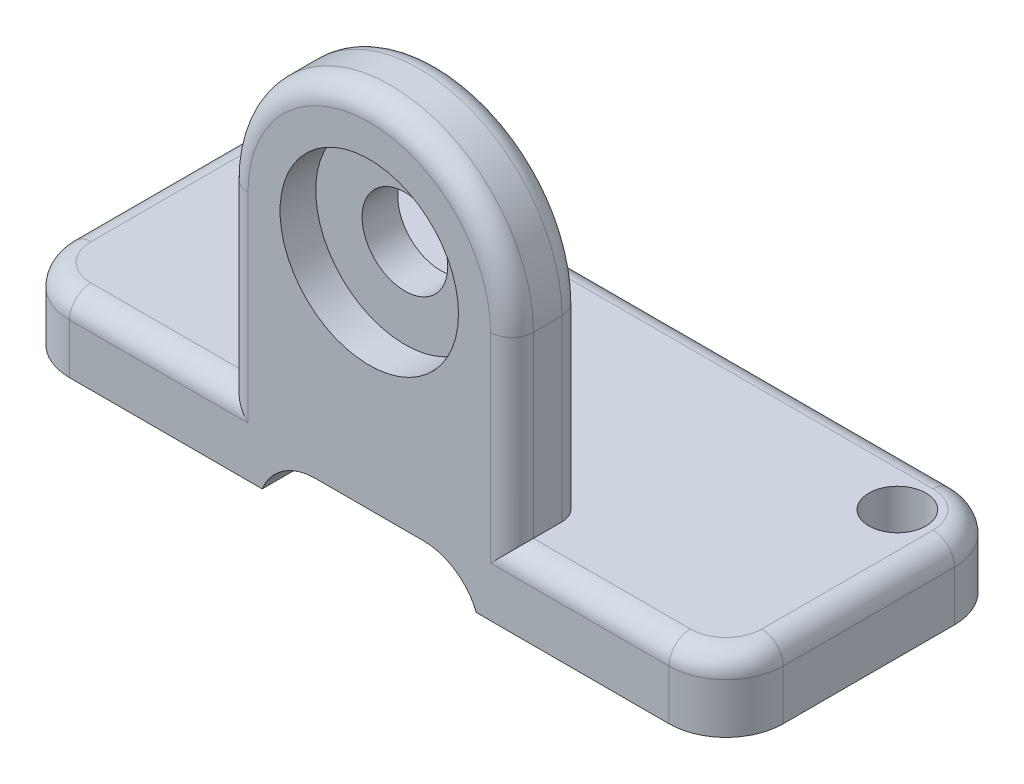
ISO-10303-21;
HEADER;
FILE_DESCRIPTION(('STEP AP214'),'2;1');
FILE_NAME('part.step','',(''),(''),'','','');
FILE_SCHEMA(('AUTOMOTIVE_DESIGN { 1 0 10303 214 1 1 1 1 }'));
ENDSEC;
DATA;
#1=APPLICATION_CONTEXT('core data for automotive mechanical design processes');
#2=APPLICATION_PROTOCOL_DEFINITION('international standard','automotive_design',2000,#1);
#3=PRODUCT_CONTEXT('',#1,'mechanical');
#4=PRODUCT('Part','Part','',(#3));
#5=PRODUCT_RELATED_PRODUCT_CATEGORY('part','',(#4));
#6=PRODUCT_DEFINITION_FORMATION('','',#4);
#7=PRODUCT_DEFINITION_CONTEXT('part definition',#1,'design');
#8=PRODUCT_DEFINITION('design','',#6,#7);
#9=PRODUCT_DEFINITION_SHAPE('','',#8);
#10=(LENGTH_UNIT() NAMED_UNIT(*) SI_UNIT(.MILLI.,.METRE.));
#11=(NAMED_UNIT(*) PLANE_ANGLE_UNIT() SI_UNIT($,.RADIAN.));
#12=(NAMED_UNIT(*) SI_UNIT($,.STERADIAN.) SOLID_ANGLE_UNIT());
#13=UNCERTAINTY_MEASURE_WITH_UNIT(LENGTH_MEASURE(1.E-05),#10,'distance_accuracy_value','');
#14=(GEOMETRIC_REPRESENTATION_CONTEXT(3) GLOBAL_UNCERTAINTY_ASSIGNED_CONTEXT((#13)) GLOBAL_UNIT_ASSIGNED_CONTEXT((#10,
#11,#12)) REPRESENTATION_CONTEXT('',''));
#15=CARTESIAN_POINT('',(0.,0.,0.));
#16=DIRECTION('',(0.,0.,1.));
#17=DIRECTION('',(1.,0.,0.));
#18=AXIS2_PLACEMENT_3D('',#15,#16,#17);
#19=CARTESIAN_POINT('',(-50.,10.,-20.));
#20=DIRECTION('',(0.,0.,1.));
#21=DIRECTION('',(1.,0.,0.));
#22=AXIS2_PLACEMENT_3D('',#19,#20,#21);
#23=PLANE('',#22);
#24=DIRECTION('',(0.,-1.,0.));
#25=VECTOR('',#24,1.);
#26=CARTESIAN_POINT('',(-42.,10.,-20.));
#27=LINE('',#26,#25);
#28=CARTESIAN_POINT('',(-42.,0.,-20.));
#29=VERTEX_POINT('',#28);
#30=CARTESIAN_POINT('',(-42.,7.,-20.));
#31=VERTEX_POINT('',#30);
#32=EDGE_CURVE('E299',#29,#31,#27,.F.);
#33=ORIENTED_EDGE('',*,*,#32,.T.);
#34=DIRECTION('',(-1.,0.,0.));
#35=VECTOR('',#34,1.);
#36=CARTESIAN_POINT('',(-50.,7.,-20.));
#37=LINE('',#36,#35);
#38=CARTESIAN_POINT('',(42.,7.,-20.));
#39=VERTEX_POINT('',#38);
#40=EDGE_CURVE('E360',#31,#39,#37,.F.);
#41=ORIENTED_EDGE('',*,*,#40,.T.);
#42=DIRECTION('',(0.,-1.,0.));
#43=VECTOR('',#42,1.);
#44=CARTESIAN_POINT('',(42.,10.,-20.));
#45=LINE('',#44,#43);
#46=CARTESIAN_POINT('',(42.,0.,-20.));
#47=VERTEX_POINT('',#46);
#48=EDGE_CURVE('E297',#39,#47,#45,.T.);
#49=ORIENTED_EDGE('',*,*,#48,.T.);
#50=DIRECTION('',(-1.,0.,0.));
#51=VECTOR('',#50,1.);
#52=CARTESIAN_POINT('',(-50.,0.,-20.));
#53=LINE('',#52,#51);
#54=CARTESIAN_POINT('',(15.,0.,-20.));
#55=VERTEX_POINT('',#54);
#56=EDGE_CURVE('E223',#47,#55,#53,.T.);
#57=ORIENTED_EDGE('',*,*,#56,.T.);
#58=CARTESIAN_POINT('',(7.58380151290434,-3.,-20.));
#59=DIRECTION('',(0.,0.,1.));
#60=DIRECTION('',(1.,0.,0.));
#61=AXIS2_PLACEMENT_3D('',#58,#59,#60);
#62=CIRCLE('',#61,8.);
#63=CARTESIAN_POINT('',(7.58380151290435,5.,-20.));
#64=VERTEX_POINT('',#63);
#65=EDGE_CURVE('E303',#55,#64,#62,.T.);
#66=ORIENTED_EDGE('',*,*,#65,.T.);
#67=DIRECTION('',(1.,0.,0.));
#68=VECTOR('',#67,1.);
#69=CARTESIAN_POINT('',(-15.,5.,-20.));
#70=LINE('',#69,#68);
#71=CARTESIAN_POINT('',(-7.58380151290433,5.,-20.));
#72=VERTEX_POINT('',#71);
#73=EDGE_CURVE('E208',#72,#64,#70,.T.);
#74=ORIENTED_EDGE('',*,*,#73,.F.);
#75=CARTESIAN_POINT('',(-7.58380151290433,-3.,-20.));
#76=DIRECTION('',(0.,0.,1.));
#77=DIRECTION('',(1.,0.,0.));
#78=AXIS2_PLACEMENT_3D('',#75,#76,#77);
#79=CIRCLE('',#78,8.);
#80=CARTESIAN_POINT('',(-15.,0.,-20.));
#81=VERTEX_POINT('',#80);
#82=EDGE_CURVE('E202',#72,#81,#79,.T.);
#83=ORIENTED_EDGE('',*,*,#82,.T.);
#84=EDGE_CURVE('E205',#81,#29,#53,.T.);
#85=ORIENTED_EDGE('',*,*,#84,.T.);
#86=EDGE_LOOP('',(#33,#41,#49,#57,#66,#74,#83,#85));
#87=FACE_BOUND('',#86,.T.);
#88=ADVANCED_FACE('F37',(#87),#23,.F.);
#89=CARTESIAN_POINT('',(-50.,10.,20.));
#90=DIRECTION('',(0.,0.,-1.));
#91=DIRECTION('',(-1.,0.,0.));
#92=AXIS2_PLACEMENT_3D('',#89,#90,#91);
#93=PLANE('',#92);
#94=CARTESIAN_POINT('',(0.,35.,20.));
#95=DIRECTION('',(0.,0.,1.));
#96=DIRECTION('',(1.,0.,0.));
#97=AXIS2_PLACEMENT_3D('',#94,#95,#96);
#98=CIRCLE('',#97,12.5);
#99=CARTESIAN_POINT('',(12.5,35.,20.));
#100=VERTEX_POINT('',#99);
#101=EDGE_CURVE('E240',#100,#100,#98,.T.);
#102=ORIENTED_EDGE('',*,*,#101,.F.);
#103=EDGE_LOOP('',(#102));
#104=FACE_BOUND('',#103,.T.);
#105=DIRECTION('',(0.,1.,0.));
#106=VECTOR('',#105,1.);
#107=CARTESIAN_POINT('',(-17.,10.,20.));
#108=LINE('',#107,#106);
#109=CARTESIAN_POINT('',(-17.,35.,20.));
#110=VERTEX_POINT('',#109);
#111=CARTESIAN_POINT('',(-17.,7.,20.));
#112=VERTEX_POINT('',#111);
#113=EDGE_CURVE('E348',#110,#112,#108,.F.);
#114=ORIENTED_EDGE('',*,*,#113,.T.);
#115=DIRECTION('',(1.,0.,0.));
#116=VECTOR('',#115,1.);
#117=CARTESIAN_POINT('',(-50.,7.,20.));
#118=LINE('',#117,#116);
#119=CARTESIAN_POINT('',(-42.,7.,20.));
#120=VERTEX_POINT('',#119);
#121=EDGE_CURVE('E350',#112,#120,#118,.F.);
#122=ORIENTED_EDGE('',*,*,#121,.T.);
#123=DIRECTION('',(0.,-1.,0.));
#124=VECTOR('',#123,1.);
#125=CARTESIAN_POINT('',(-42.,10.,20.));
#126=LINE('',#125,#124);
#127=CARTESIAN_POINT('',(-42.,0.,20.));
#128=VERTEX_POINT('',#127);
#129=EDGE_CURVE('E284',#120,#128,#126,.T.);
#130=ORIENTED_EDGE('',*,*,#129,.T.);
#131=DIRECTION('',(1.,0.,0.));
#132=VECTOR('',#131,1.);
#133=CARTESIAN_POINT('',(-50.,0.,20.));
#134=LINE('',#133,#132);
#135=CARTESIAN_POINT('',(-15.,0.,20.));
#136=VERTEX_POINT('',#135);
#137=EDGE_CURVE('E269',#128,#136,#134,.T.);
#138=ORIENTED_EDGE('',*,*,#137,.T.);
#139=CARTESIAN_POINT('',(-7.58380151290433,-3.,20.));
#140=DIRECTION('',(0.,0.,-1.));
#141=DIRECTION('',(-1.,0.,0.));
#142=AXIS2_PLACEMENT_3D('',#139,#140,#141);
#143=CIRCLE('',#142,8.);
#144=CARTESIAN_POINT('',(-7.58380151290433,5.,20.));
#145=VERTEX_POINT('',#144);
#146=EDGE_CURVE('E213',#136,#145,#143,.T.);
#147=ORIENTED_EDGE('',*,*,#146,.T.);
#148=DIRECTION('',(1.,0.,0.));
#149=VECTOR('',#148,1.);
#150=CARTESIAN_POINT('',(-15.,5.,20.));
#151=LINE('',#150,#149);
#152=CARTESIAN_POINT('',(7.58380151290435,5.,20.));
#153=VERTEX_POINT('',#152);
#154=EDGE_CURVE('E233',#145,#153,#151,.T.);
#155=ORIENTED_EDGE('',*,*,#154,.T.);
#156=CARTESIAN_POINT('',(7.58380151290434,-3.,20.));
#157=DIRECTION('',(0.,0.,-1.));
#158=DIRECTION('',(-1.,0.,0.));
#159=AXIS2_PLACEMENT_3D('',#156,#157,#158);
#160=CIRCLE('',#159,8.);
#161=CARTESIAN_POINT('',(15.,0.,20.));
#162=VERTEX_POINT('',#161);
#163=EDGE_CURVE('E212',#153,#162,#160,.T.);
#164=ORIENTED_EDGE('',*,*,#163,.T.);
#165=CARTESIAN_POINT('',(42.,0.,20.));
#166=VERTEX_POINT('',#165);
#167=EDGE_CURVE('E268',#162,#166,#134,.T.);
#168=ORIENTED_EDGE('',*,*,#167,.T.);
#169=DIRECTION('',(0.,-1.,0.));
#170=VECTOR('',#169,1.);
#171=CARTESIAN_POINT('',(42.,10.,20.));
#172=LINE('',#171,#170);
#173=CARTESIAN_POINT('',(42.,7.,20.));
#174=VERTEX_POINT('',#173);
#175=EDGE_CURVE('E286',#166,#174,#172,.F.);
#176=ORIENTED_EDGE('',*,*,#175,.T.);
#177=DIRECTION('',(1.,0.,0.));
#178=VECTOR('',#177,1.);
#179=CARTESIAN_POINT('',(-50.,7.,20.));
#180=LINE('',#179,#178);
#181=CARTESIAN_POINT('',(17.,7.,20.));
#182=VERTEX_POINT('',#181);
#183=EDGE_CURVE('E342',#174,#182,#180,.F.);
#184=ORIENTED_EDGE('',*,*,#183,.T.);
#185=DIRECTION('',(0.,1.,0.));
#186=VECTOR('',#185,1.);
#187=CARTESIAN_POINT('',(17.,35.,20.));
#188=LINE('',#187,#186);
#189=CARTESIAN_POINT('',(17.,35.,20.));
#190=VERTEX_POINT('',#189);
#191=EDGE_CURVE('E344',#182,#190,#188,.T.);
#192=ORIENTED_EDGE('',*,*,#191,.T.);
#193=CARTESIAN_POINT('',(0.,35.,20.));
#194=DIRECTION('',(0.,0.,-1.));
#195=DIRECTION('',(-1.,0.,0.));
#196=AXIS2_PLACEMENT_3D('',#193,#194,#195);
#197=CIRCLE('',#196,17.);
#198=EDGE_CURVE('E346',#190,#110,#197,.F.);
#199=ORIENTED_EDGE('',*,*,#198,.T.);
#200=EDGE_LOOP('',(#114,#122,#130,#138,#147,#155,#164,#168,#176,#184,#192,#199));
#201=FACE_BOUND('',#200,.T.);
#202=ADVANCED_FACE('F417',(#104,#201),#93,.F.);
#203=CARTESIAN_POINT('',(0.,0.,0.));
#204=DIRECTION('',(0.,-1.,0.));
#205=DIRECTION('',(0.,0.,-1.));
#206=AXIS2_PLACEMENT_3D('',#203,#204,#205);
#207=PLANE('',#206);
#208=CARTESIAN_POINT('',(-42.,0.,-12.));
#209=DIRECTION('',(0.,1.,0.));
#210=DIRECTION('',(0.,0.,1.));
#211=AXIS2_PLACEMENT_3D('',#208,#209,#210);
#212=CIRCLE('',#211,4.);
#213=CARTESIAN_POINT('',(-42.,0.,-8.));
#214=VERTEX_POINT('',#213);
#215=EDGE_CURVE('E855',#214,#214,#212,.T.);
#216=ORIENTED_EDGE('',*,*,#215,.T.);
#217=EDGE_LOOP('',(#216));
#218=FACE_BOUND('',#217,.T.);
#219=ORIENTED_EDGE('',*,*,#137,.F.);
#220=CARTESIAN_POINT('',(-42.,0.,12.));
#221=DIRECTION('',(0.,-1.,0.));
#222=DIRECTION('',(0.,0.,-1.));
#223=AXIS2_PLACEMENT_3D('',#220,#221,#222);
#224=CIRCLE('',#223,8.);
#225=CARTESIAN_POINT('',(-50.,0.,12.));
#226=VERTEX_POINT('',#225);
#227=EDGE_CURVE('E290',#128,#226,#224,.T.);
#228=ORIENTED_EDGE('',*,*,#227,.T.);
#229=DIRECTION('',(0.,0.,1.));
#230=VECTOR('',#229,1.);
#231=CARTESIAN_POINT('',(-50.,0.,20.));
#232=LINE('',#231,#230);
#233=CARTESIAN_POINT('',(-50.,0.,-12.));
#234=VERTEX_POINT('',#233);
#235=EDGE_CURVE('E265',#234,#226,#232,.T.);
#236=ORIENTED_EDGE('',*,*,#235,.F.);
#237=CARTESIAN_POINT('',(-42.,0.,-12.));
#238=DIRECTION('',(0.,-1.,0.));
#239=DIRECTION('',(0.,0.,-1.));
#240=AXIS2_PLACEMENT_3D('',#237,#238,#239);
#241=CIRCLE('',#240,8.);
#242=EDGE_CURVE('E222',#234,#29,#241,.T.);
#243=ORIENTED_EDGE('',*,*,#242,.T.);
#244=ORIENTED_EDGE('',*,*,#84,.F.);
#245=DIRECTION('',(0.,0.,1.));
#246=VECTOR('',#245,1.);
#247=CARTESIAN_POINT('',(-15.,0.,-20.));
#248=LINE('',#247,#246);
#249=EDGE_CURVE('E219',#81,#136,#248,.T.);
#250=ORIENTED_EDGE('',*,*,#249,.T.);
#251=EDGE_LOOP('',(#219,#228,#236,#243,#244,#250));
#252=FACE_BOUND('',#251,.T.);
#253=ADVANCED_FACE('F218',(#218,#252),#207,.T.);
#254=CARTESIAN_POINT('',(42.,0.,-12.));
#255=DIRECTION('',(0.,1.,0.));
#256=DIRECTION('',(0.,0.,1.));
#257=AXIS2_PLACEMENT_3D('',#254,#255,#256);
#258=CIRCLE('',#257,4.);
#259=CARTESIAN_POINT('',(42.,0.,-8.00000000000001));
#260=VERTEX_POINT('',#259);
#261=EDGE_CURVE('E827',#260,#260,#258,.T.);
#262=ORIENTED_EDGE('',*,*,#261,.T.);
#263=EDGE_LOOP('',(#262));
#264=FACE_BOUND('',#263,.T.);
#265=DIRECTION('',(0.,0.,-1.));
#266=VECTOR('',#265,1.);
#267=CARTESIAN_POINT('',(50.,0.,20.));
#268=LINE('',#267,#266);
#269=CARTESIAN_POINT('',(50.,0.,12.));
#270=VERTEX_POINT('',#269);
#271=CARTESIAN_POINT('',(50.,0.,-12.));
#272=VERTEX_POINT('',#271);
#273=EDGE_CURVE('E224',#270,#272,#268,.T.);
#274=ORIENTED_EDGE('',*,*,#273,.F.);
#275=CARTESIAN_POINT('',(42.,0.,12.));
#276=DIRECTION('',(0.,-1.,0.));
#277=DIRECTION('',(0.,0.,-1.));
#278=AXIS2_PLACEMENT_3D('',#275,#276,#277);
#279=CIRCLE('',#278,8.);
#280=EDGE_CURVE('E282',#270,#166,#279,.T.);
#281=ORIENTED_EDGE('',*,*,#280,.T.);
#282=ORIENTED_EDGE('',*,*,#167,.F.);
#283=DIRECTION('',(0.,0.,1.));
#284=VECTOR('',#283,1.);
#285=CARTESIAN_POINT('',(15.,0.,-20.));
#286=LINE('',#285,#284);
#287=EDGE_CURVE('E228',#55,#162,#286,.T.);
#288=ORIENTED_EDGE('',*,*,#287,.F.);
#289=ORIENTED_EDGE('',*,*,#56,.F.);
#290=CARTESIAN_POINT('',(42.,0.,-12.));
#291=DIRECTION('',(0.,-1.,0.));
#292=DIRECTION('',(0.,0.,-1.));
#293=AXIS2_PLACEMENT_3D('',#290,#291,#292);
#294=CIRCLE('',#293,8.);
#295=EDGE_CURVE('E280',#47,#272,#294,.T.);
#296=ORIENTED_EDGE('',*,*,#295,.T.);
#297=EDGE_LOOP('',(#274,#281,#282,#288,#289,#296));
#298=FACE_BOUND('',#297,.T.);
#299=ADVANCED_FACE('F687',(#264,#298),#207,.T.);
#300=CARTESIAN_POINT('',(0.,10.,0.));
#301=DIRECTION('',(0.,-1.,0.));
#302=DIRECTION('',(0.,0.,-1.));
#303=AXIS2_PLACEMENT_3D('',#300,#301,#302);
#304=PLANE('',#303);
#305=CARTESIAN_POINT('',(-42.,10.,-12.));
#306=DIRECTION('',(0.,1.,0.));
#307=DIRECTION('',(0.,0.,1.));
#308=AXIS2_PLACEMENT_3D('',#305,#306,#307);
#309=CIRCLE('',#308,4.);
#310=CARTESIAN_POINT('',(-42.,10.,-8.));
#311=VERTEX_POINT('',#310);
#312=EDGE_CURVE('E857',#311,#311,#309,.T.);
#313=ORIENTED_EDGE('',*,*,#312,.F.);
#314=EDGE_LOOP('',(#313));
#315=FACE_BOUND('',#314,.T.);
#316=CARTESIAN_POINT('',(42.,10.,-12.));
#317=DIRECTION('',(0.,1.,0.));
#318=DIRECTION('',(0.,0.,1.));
#319=AXIS2_PLACEMENT_3D('',#316,#317,#318);
#320=CIRCLE('',#319,4.);
#321=CARTESIAN_POINT('',(42.,10.,-8.00000000000001));
#322=VERTEX_POINT('',#321);
#323=EDGE_CURVE('E372',#322,#322,#320,.T.);
#324=ORIENTED_EDGE('',*,*,#323,.F.);
#325=EDGE_LOOP('',(#324));
#326=FACE_BOUND('',#325,.T.);
#327=CARTESIAN_POINT('',(-42.,10.,12.));
#328=DIRECTION('',(0.,-1.,0.));
#329=DIRECTION('',(0.,0.,-1.));
#330=AXIS2_PLACEMENT_3D('',#327,#328,#329);
#331=CIRCLE('',#330,5.);
#332=CARTESIAN_POINT('',(-47.,10.,12.));
#333=VERTEX_POINT('',#332);
#334=CARTESIAN_POINT('',(-42.,10.,17.));
#335=VERTEX_POINT('',#334);
#336=EDGE_CURVE('E335',#333,#335,#331,.F.);
#337=ORIENTED_EDGE('',*,*,#336,.T.);
#338=DIRECTION('',(1.,0.,0.));
#339=VECTOR('',#338,1.);
#340=CARTESIAN_POINT('',(0.,10.,17.));
#341=LINE('',#340,#339);
#342=CARTESIAN_POINT('',(-20.,10.,17.));
#343=VERTEX_POINT('',#342);
#344=EDGE_CURVE('E337',#335,#343,#341,.T.);
#345=ORIENTED_EDGE('',*,*,#344,.T.);
#346=DIRECTION('',(0.,0.,1.));
#347=VECTOR('',#346,1.);
#348=CARTESIAN_POINT('',(-20.,10.,0.));
#349=LINE('',#348,#347);
#350=CARTESIAN_POINT('',(-20.,10.,13.));
#351=VERTEX_POINT('',#350);
#352=EDGE_CURVE('E260',#351,#343,#349,.T.);
#353=ORIENTED_EDGE('',*,*,#352,.F.);
#354=CARTESIAN_POINT('',(-17.,10.,13.));
#355=DIRECTION('',(0.,-1.,0.));
#356=DIRECTION('',(0.,0.,-1.));
#357=AXIS2_PLACEMENT_3D('',#354,#355,#356);
#358=CIRCLE('',#357,3.);
#359=CARTESIAN_POINT('',(-17.,10.,10.));
#360=VERTEX_POINT('',#359);
#361=EDGE_CURVE('E11',#351,#360,#358,.T.);
#362=ORIENTED_EDGE('',*,*,#361,.T.);
#363=DIRECTION('',(1.,0.,0.));
#364=VECTOR('',#363,1.);
#365=CARTESIAN_POINT('',(0.,10.,10.));
#366=LINE('',#365,#364);
#367=CARTESIAN_POINT('',(17.,10.,10.));
#368=VERTEX_POINT('',#367);
#369=EDGE_CURVE('E254',#360,#368,#366,.T.);
#370=ORIENTED_EDGE('',*,*,#369,.T.);
#371=CARTESIAN_POINT('',(17.,10.,13.));
#372=DIRECTION('',(0.,-1.,0.));
#373=DIRECTION('',(0.,0.,-1.));
#374=AXIS2_PLACEMENT_3D('',#371,#372,#373);
#375=CIRCLE('',#374,3.);
#376=CARTESIAN_POINT('',(20.,10.,13.));
#377=VERTEX_POINT('',#376);
#378=EDGE_CURVE('E46',#368,#377,#375,.T.);
#379=ORIENTED_EDGE('',*,*,#378,.T.);
#380=DIRECTION('',(0.,0.,1.));
#381=VECTOR('',#380,1.);
#382=CARTESIAN_POINT('',(20.,10.,0.));
#383=LINE('',#382,#381);
#384=CARTESIAN_POINT('',(20.,10.,17.));
#385=VERTEX_POINT('',#384);
#386=EDGE_CURVE('E257',#377,#385,#383,.T.);
#387=ORIENTED_EDGE('',*,*,#386,.T.);
#388=DIRECTION('',(1.,0.,0.));
#389=VECTOR('',#388,1.);
#390=CARTESIAN_POINT('',(0.,10.,17.));
#391=LINE('',#390,#389);
#392=CARTESIAN_POINT('',(42.,10.,17.));
#393=VERTEX_POINT('',#392);
#394=EDGE_CURVE('E320',#385,#393,#391,.T.);
#395=ORIENTED_EDGE('',*,*,#394,.T.);
#396=CARTESIAN_POINT('',(42.,10.,12.));
#397=DIRECTION('',(0.,-1.,0.));
#398=DIRECTION('',(0.,0.,-1.));
#399=AXIS2_PLACEMENT_3D('',#396,#397,#398);
#400=CIRCLE('',#399,5.);
#401=CARTESIAN_POINT('',(47.,10.,12.));
#402=VERTEX_POINT('',#401);
#403=EDGE_CURVE('E322',#393,#402,#400,.F.);
#404=ORIENTED_EDGE('',*,*,#403,.T.);
#405=DIRECTION('',(0.,0.,-1.));
#406=VECTOR('',#405,1.);
#407=CARTESIAN_POINT('',(47.,10.,0.));
#408=LINE('',#407,#406);
#409=CARTESIAN_POINT('',(47.,10.,-12.));
#410=VERTEX_POINT('',#409);
#411=EDGE_CURVE('E324',#402,#410,#408,.T.);
#412=ORIENTED_EDGE('',*,*,#411,.T.);
#413=CARTESIAN_POINT('',(42.,10.,-12.));
#414=DIRECTION('',(0.,-1.,0.));
#415=DIRECTION('',(0.,0.,-1.));
#416=AXIS2_PLACEMENT_3D('',#413,#414,#415);
#417=CIRCLE('',#416,5.);
#418=CARTESIAN_POINT('',(42.,10.,-17.));
#419=VERTEX_POINT('',#418);
#420=EDGE_CURVE('E326',#410,#419,#417,.F.);
#421=ORIENTED_EDGE('',*,*,#420,.T.);
#422=DIRECTION('',(-1.,0.,0.));
#423=VECTOR('',#422,1.);
#424=CARTESIAN_POINT('',(0.,10.,-17.));
#425=LINE('',#424,#423);
#426=CARTESIAN_POINT('',(-42.,10.,-17.));
#427=VERTEX_POINT('',#426);
#428=EDGE_CURVE('E328',#419,#427,#425,.T.);
#429=ORIENTED_EDGE('',*,*,#428,.T.);
#430=CARTESIAN_POINT('',(-42.,10.,-12.));
#431=DIRECTION('',(0.,-1.,0.));
#432=DIRECTION('',(0.,0.,-1.));
#433=AXIS2_PLACEMENT_3D('',#430,#431,#432);
#434=CIRCLE('',#433,5.);
#435=CARTESIAN_POINT('',(-47.,10.,-12.));
#436=VERTEX_POINT('',#435);
#437=EDGE_CURVE('E330',#427,#436,#434,.F.);
#438=ORIENTED_EDGE('',*,*,#437,.T.);
#439=DIRECTION('',(0.,0.,1.));
#440=VECTOR('',#439,1.);
#441=CARTESIAN_POINT('',(-47.,10.,0.));
#442=LINE('',#441,#440);
#443=EDGE_CURVE('E333',#436,#333,#442,.T.);
#444=ORIENTED_EDGE('',*,*,#443,.T.);
#445=EDGE_LOOP('',(#337,#345,#353,#362,#370,#379,#387,#395,#404,#412,#421,#429,#438,#444));
#446=FACE_BOUND('',#445,.T.);
#447=ADVANCED_FACE('F437',(#315,#326,#446),#304,.F.);
#448=CARTESIAN_POINT('',(50.,10.,20.));
#449=DIRECTION('',(-1.,0.,0.));
#450=DIRECTION('',(0.,0.,1.));
#451=AXIS2_PLACEMENT_3D('',#448,#449,#450);
#452=PLANE('',#451);
#453=DIRECTION('',(0.,-1.,0.));
#454=VECTOR('',#453,1.);
#455=CARTESIAN_POINT('',(50.,10.,-12.));
#456=LINE('',#455,#454);
#457=CARTESIAN_POINT('',(50.,7.,-12.));
#458=VERTEX_POINT('',#457);
#459=EDGE_CURVE('E276',#272,#458,#456,.F.);
#460=ORIENTED_EDGE('',*,*,#459,.T.);
#461=DIRECTION('',(0.,0.,-1.));
#462=VECTOR('',#461,1.);
#463=CARTESIAN_POINT('',(50.,7.,20.));
#464=LINE('',#463,#462);
#465=CARTESIAN_POINT('',(50.,7.,12.));
#466=VERTEX_POINT('',#465);
#467=EDGE_CURVE('E54',#458,#466,#464,.F.);
#468=ORIENTED_EDGE('',*,*,#467,.T.);
#469=DIRECTION('',(0.,-1.,0.));
#470=VECTOR('',#469,1.);
#471=CARTESIAN_POINT('',(50.,10.,12.));
#472=LINE('',#471,#470);
#473=EDGE_CURVE('E278',#466,#270,#472,.T.);
#474=ORIENTED_EDGE('',*,*,#473,.T.);
#475=ORIENTED_EDGE('',*,*,#273,.T.);
#476=EDGE_LOOP('',(#460,#468,#474,#475));
#477=FACE_BOUND('',#476,.T.);
#478=ADVANCED_FACE('F490',(#477),#452,.F.);
#479=CARTESIAN_POINT('',(-50.,10.,20.));
#480=DIRECTION('',(1.,0.,0.));
#481=DIRECTION('',(0.,0.,-1.));
#482=AXIS2_PLACEMENT_3D('',#479,#480,#481);
#483=PLANE('',#482);
#484=DIRECTION('',(0.,-1.,0.));
#485=VECTOR('',#484,1.);
#486=CARTESIAN_POINT('',(-50.,10.,12.));
#487=LINE('',#486,#485);
#488=CARTESIAN_POINT('',(-50.,7.,12.));
#489=VERTEX_POINT('',#488);
#490=EDGE_CURVE('E294',#226,#489,#487,.F.);
#491=ORIENTED_EDGE('',*,*,#490,.T.);
#492=DIRECTION('',(0.,0.,1.));
#493=VECTOR('',#492,1.);
#494=CARTESIAN_POINT('',(-50.,7.,20.));
#495=LINE('',#494,#493);
#496=CARTESIAN_POINT('',(-50.,7.,-12.));
#497=VERTEX_POINT('',#496);
#498=EDGE_CURVE('E356',#489,#497,#495,.F.);
#499=ORIENTED_EDGE('',*,*,#498,.T.);
#500=DIRECTION('',(0.,-1.,0.));
#501=VECTOR('',#500,1.);
#502=CARTESIAN_POINT('',(-50.,10.,-12.));
#503=LINE('',#502,#501);
#504=EDGE_CURVE('E292',#497,#234,#503,.T.);
#505=ORIENTED_EDGE('',*,*,#504,.T.);
#506=ORIENTED_EDGE('',*,*,#235,.T.);
#507=EDGE_LOOP('',(#491,#499,#505,#506));
#508=FACE_BOUND('',#507,.T.);
#509=ADVANCED_FACE('F489',(#508),#483,.F.);
#510=CARTESIAN_POINT('',(-20.,0.,10.));
#511=DIRECTION('',(1.,0.,0.));
#512=DIRECTION('',(0.,0.,-1.));
#513=AXIS2_PLACEMENT_3D('',#510,#511,#512);
#514=PLANE('',#513);
#515=DIRECTION('',(0.,0.,1.));
#516=VECTOR('',#515,1.);
#517=CARTESIAN_POINT('',(-20.,35.,10.));
#518=LINE('',#517,#516);
#519=CARTESIAN_POINT('',(-20.,35.,13.));
#520=VERTEX_POINT('',#519);
#521=CARTESIAN_POINT('',(-20.,35.,17.));
#522=VERTEX_POINT('',#521);
#523=EDGE_CURVE('E251',#520,#522,#518,.T.);
#524=ORIENTED_EDGE('',*,*,#523,.F.);
#525=DIRECTION('',(0.,1.,0.));
#526=VECTOR('',#525,1.);
#527=CARTESIAN_POINT('',(-20.,10.,13.));
#528=LINE('',#527,#526);
#529=EDGE_CURVE('E318',#520,#351,#528,.F.);
#530=ORIENTED_EDGE('',*,*,#529,.T.);
#531=ORIENTED_EDGE('',*,*,#352,.T.);
#532=DIRECTION('',(0.,1.,0.));
#533=VECTOR('',#532,1.);
#534=CARTESIAN_POINT('',(-20.,0.,17.));
#535=LINE('',#534,#533);
#536=EDGE_CURVE('E316',#343,#522,#535,.T.);
#537=ORIENTED_EDGE('',*,*,#536,.T.);
#538=EDGE_LOOP('',(#524,#530,#531,#537));
#539=FACE_BOUND('',#538,.T.);
#540=ADVANCED_FACE('F459',(#539),#514,.F.);
#541=CARTESIAN_POINT('',(20.,0.,10.));
#542=DIRECTION('',(1.,0.,0.));
#543=DIRECTION('',(0.,1.,0.));
#544=AXIS2_PLACEMENT_3D('',#541,#542,#543);
#545=PLANE('',#544);
#546=ORIENTED_EDGE('',*,*,#386,.F.);
#547=DIRECTION('',(0.,1.,0.));
#548=VECTOR('',#547,1.);
#549=CARTESIAN_POINT('',(20.,0.,13.));
#550=LINE('',#549,#548);
#551=CARTESIAN_POINT('',(20.,35.,13.));
#552=VERTEX_POINT('',#551);
#553=EDGE_CURVE('E307',#377,#552,#550,.T.);
#554=ORIENTED_EDGE('',*,*,#553,.T.);
#555=DIRECTION('',(0.,0.,1.));
#556=VECTOR('',#555,1.);
#557=CARTESIAN_POINT('',(20.,35.,10.));
#558=LINE('',#557,#556);
#559=CARTESIAN_POINT('',(20.,35.,17.));
#560=VERTEX_POINT('',#559);
#561=EDGE_CURVE('E246',#552,#560,#558,.T.);
#562=ORIENTED_EDGE('',*,*,#561,.T.);
#563=DIRECTION('',(0.,1.,0.));
#564=VECTOR('',#563,1.);
#565=CARTESIAN_POINT('',(20.,10.,17.));
#566=LINE('',#565,#564);
#567=EDGE_CURVE('E305',#560,#385,#566,.F.);
#568=ORIENTED_EDGE('',*,*,#567,.T.);
#569=EDGE_LOOP('',(#546,#554,#562,#568));
#570=FACE_BOUND('',#569,.T.);
#571=ADVANCED_FACE('F443',(#570),#545,.T.);
#572=CARTESIAN_POINT('',(0.,35.,10.));
#573=DIRECTION('',(0.,0.,-1.));
#574=DIRECTION('',(-1.,0.,0.));
#575=AXIS2_PLACEMENT_3D('',#572,#573,#574);
#576=PLANE('',#575);
#577=CARTESIAN_POINT('',(0.,35.,10.));
#578=DIRECTION('',(0.,0.,1.));
#579=DIRECTION('',(1.,0.,0.));
#580=AXIS2_PLACEMENT_3D('',#577,#578,#579);
#581=CIRCLE('',#580,6.);
#582=CARTESIAN_POINT('',(6.,35.,10.));
#583=VERTEX_POINT('',#582);
#584=EDGE_CURVE('E237',#583,#583,#581,.T.);
#585=ORIENTED_EDGE('',*,*,#584,.T.);
#586=EDGE_LOOP('',(#585));
#587=FACE_BOUND('',#586,.T.);
#588=CARTESIAN_POINT('',(0.,35.,10.));
#589=DIRECTION('',(0.,0.,-1.));
#590=DIRECTION('',(-1.,0.,0.));
#591=AXIS2_PLACEMENT_3D('',#588,#589,#590);
#592=CIRCLE('',#591,17.);
#593=CARTESIAN_POINT('',(-17.,35.,10.));
#594=VERTEX_POINT('',#593);
#595=CARTESIAN_POINT('',(17.,35.,10.));
#596=VERTEX_POINT('',#595);
#597=EDGE_CURVE('E310',#594,#596,#592,.T.);
#598=ORIENTED_EDGE('',*,*,#597,.T.);
#599=DIRECTION('',(0.,1.,0.));
#600=VECTOR('',#599,1.);
#601=CARTESIAN_POINT('',(17.,35.,10.));
#602=LINE('',#601,#600);
#603=EDGE_CURVE('E314',#596,#368,#602,.F.);
#604=ORIENTED_EDGE('',*,*,#603,.T.);
#605=ORIENTED_EDGE('',*,*,#369,.F.);
#606=DIRECTION('',(0.,1.,0.));
#607=VECTOR('',#606,1.);
#608=CARTESIAN_POINT('',(-17.,35.,10.));
#609=LINE('',#608,#607);
#610=EDGE_CURVE('E312',#360,#594,#609,.T.);
#611=ORIENTED_EDGE('',*,*,#610,.T.);
#612=EDGE_LOOP('',(#598,#604,#605,#611));
#613=FACE_BOUND('',#612,.T.);
#614=ADVANCED_FACE('F468',(#587,#613),#576,.T.);
#615=CARTESIAN_POINT('',(0.,35.,10.));
#616=DIRECTION('',(0.,0.,1.));
#617=DIRECTION('',(1.,0.,0.));
#618=AXIS2_PLACEMENT_3D('',#615,#616,#617);
#619=CYLINDRICAL_SURFACE('',#618,20.);
#620=ORIENTED_EDGE('',*,*,#561,.F.);
#621=CARTESIAN_POINT('',(0.,35.,13.));
#622=DIRECTION('',(0.,0.,-1.));
#623=DIRECTION('',(-1.,0.,0.));
#624=AXIS2_PLACEMENT_3D('',#621,#622,#623);
#625=CIRCLE('',#624,20.);
#626=EDGE_CURVE('E354',#552,#520,#625,.F.);
#627=ORIENTED_EDGE('',*,*,#626,.T.);
#628=ORIENTED_EDGE('',*,*,#523,.T.);
#629=CARTESIAN_POINT('',(0.,35.,17.));
#630=DIRECTION('',(0.,0.,-1.));
#631=DIRECTION('',(-1.,0.,0.));
#632=AXIS2_PLACEMENT_3D('',#629,#630,#631);
#633=CIRCLE('',#632,20.);
#634=EDGE_CURVE('E352',#522,#560,#633,.T.);
#635=ORIENTED_EDGE('',*,*,#634,.T.);
#636=EDGE_LOOP('',(#620,#627,#628,#635));
#637=FACE_BOUND('',#636,.T.);
#638=ADVANCED_FACE('F456',(#637),#619,.T.);
#639=CARTESIAN_POINT('',(0.,35.,15.));
#640=DIRECTION('',(0.,0.,1.));
#641=DIRECTION('',(1.,0.,0.));
#642=AXIS2_PLACEMENT_3D('',#639,#640,#641);
#643=CYLINDRICAL_SURFACE('',#642,12.5);
#644=CARTESIAN_POINT('',(0.,35.,15.));
#645=DIRECTION('',(0.,0.,1.));
#646=DIRECTION('',(1.,0.,0.));
#647=AXIS2_PLACEMENT_3D('',#644,#645,#646);
#648=CIRCLE('',#647,12.5);
#649=CARTESIAN_POINT('',(12.5,35.,15.));
#650=VERTEX_POINT('',#649);
#651=EDGE_CURVE('E243',#650,#650,#648,.T.);
#652=ORIENTED_EDGE('',*,*,#651,.F.);
#653=EDGE_LOOP('',(#652));
#654=FACE_BOUND('',#653,.T.);
#655=ORIENTED_EDGE('',*,*,#101,.T.);
#656=EDGE_LOOP('',(#655));
#657=FACE_BOUND('',#656,.T.);
#658=ADVANCED_FACE('F476',(#654,#657),#643,.F.);
#659=CARTESIAN_POINT('',(0.,35.,15.));
#660=DIRECTION('',(0.,0.,1.));
#661=DIRECTION('',(1.,0.,0.));
#662=AXIS2_PLACEMENT_3D('',#659,#660,#661);
#663=PLANE('',#662);
#664=CARTESIAN_POINT('',(0.,35.,15.));
#665=DIRECTION('',(0.,0.,1.));
#666=DIRECTION('',(1.,0.,0.));
#667=AXIS2_PLACEMENT_3D('',#664,#665,#666);
#668=CIRCLE('',#667,6.);
#669=CARTESIAN_POINT('',(6.,35.,15.));
#670=VERTEX_POINT('',#669);
#671=EDGE_CURVE('E231',#670,#670,#668,.T.);
#672=ORIENTED_EDGE('',*,*,#671,.F.);
#673=EDGE_LOOP('',(#672));
#674=FACE_BOUND('',#673,.T.);
#675=ORIENTED_EDGE('',*,*,#651,.T.);
#676=EDGE_LOOP('',(#675));
#677=FACE_BOUND('',#676,.T.);
#678=ADVANCED_FACE('F628',(#674,#677),#663,.T.);
#679=CARTESIAN_POINT('',(0.,35.,10.));
#680=DIRECTION('',(0.,0.,1.));
#681=DIRECTION('',(1.,0.,0.));
#682=AXIS2_PLACEMENT_3D('',#679,#680,#681);
#683=CYLINDRICAL_SURFACE('',#682,6.);
#684=ORIENTED_EDGE('',*,*,#584,.F.);
#685=EDGE_LOOP('',(#684));
#686=FACE_BOUND('',#685,.T.);
#687=ORIENTED_EDGE('',*,*,#671,.T.);
#688=EDGE_LOOP('',(#687));
#689=FACE_BOUND('',#688,.T.);
#690=ADVANCED_FACE('F620',(#686,#689),#683,.F.);
#691=CARTESIAN_POINT('',(-15.,5.,-20.));
#692=DIRECTION('',(0.,-1.,0.));
#693=DIRECTION('',(0.,0.,-1.));
#694=AXIS2_PLACEMENT_3D('',#691,#692,#693);
#695=PLANE('',#694);
#696=ORIENTED_EDGE('',*,*,#154,.F.);
#697=DIRECTION('',(0.,0.,1.));
#698=VECTOR('',#697,1.);
#699=CARTESIAN_POINT('',(-7.58380151290433,5.,-20.));
#700=LINE('',#699,#698);
#701=EDGE_CURVE('E274',#145,#72,#700,.F.);
#702=ORIENTED_EDGE('',*,*,#701,.T.);
#703=ORIENTED_EDGE('',*,*,#73,.T.);
#704=DIRECTION('',(0.,0.,-1.));
#705=VECTOR('',#704,1.);
#706=CARTESIAN_POINT('',(7.58380151290434,5.,20.));
#707=LINE('',#706,#705);
#708=EDGE_CURVE('E271',#64,#153,#707,.F.);
#709=ORIENTED_EDGE('',*,*,#708,.T.);
#710=EDGE_LOOP('',(#696,#702,#703,#709));
#711=FACE_BOUND('',#710,.T.);
#712=ADVANCED_FACE('F612',(#711),#695,.T.);
#713=CARTESIAN_POINT('',(42.,0.,-12.));
#714=DIRECTION('',(0.,1.,0.));
#715=DIRECTION('',(0.,0.,1.));
#716=AXIS2_PLACEMENT_3D('',#713,#714,#715);
#717=CYLINDRICAL_SURFACE('',#716,4.);
#718=ORIENTED_EDGE('',*,*,#261,.F.);
#719=EDGE_LOOP('',(#718));
#720=FACE_BOUND('',#719,.T.);
#721=ORIENTED_EDGE('',*,*,#323,.T.);
#722=EDGE_LOOP('',(#721));
#723=FACE_BOUND('',#722,.T.);
#724=ADVANCED_FACE('F603',(#720,#723),#717,.F.);
#725=CARTESIAN_POINT('',(-42.,0.,-12.));
#726=DIRECTION('',(0.,1.,0.));
#727=DIRECTION('',(0.,0.,1.));
#728=AXIS2_PLACEMENT_3D('',#725,#726,#727);
#729=CYLINDRICAL_SURFACE('',#728,4.);
#730=ORIENTED_EDGE('',*,*,#215,.F.);
#731=EDGE_LOOP('',(#730));
#732=FACE_BOUND('',#731,.T.);
#733=ORIENTED_EDGE('',*,*,#312,.T.);
#734=EDGE_LOOP('',(#733));
#735=FACE_BOUND('',#734,.T.);
#736=ADVANCED_FACE('F496',(#732,#735),#729,.F.);
#737=CARTESIAN_POINT('',(-7.58380151290433,-3.,-20.));
#738=DIRECTION('',(0.,0.,-1.));
#739=DIRECTION('',(-1.,0.,0.));
#740=AXIS2_PLACEMENT_3D('',#737,#738,#739);
#741=CYLINDRICAL_SURFACE('',#740,8.);
#742=ORIENTED_EDGE('',*,*,#82,.F.);
#743=ORIENTED_EDGE('',*,*,#701,.F.);
#744=ORIENTED_EDGE('',*,*,#146,.F.);
#745=ORIENTED_EDGE('',*,*,#249,.F.);
#746=EDGE_LOOP('',(#742,#743,#744,#745));
#747=FACE_BOUND('',#746,.T.);
#748=ADVANCED_FACE('F226',(#747),#741,.F.);
#749=CARTESIAN_POINT('',(7.58380151290434,-3.,-20.));
#750=DIRECTION('',(0.,0.,1.));
#751=DIRECTION('',(1.,0.,0.));
#752=AXIS2_PLACEMENT_3D('',#749,#750,#751);
#753=CYLINDRICAL_SURFACE('',#752,8.);
#754=ORIENTED_EDGE('',*,*,#65,.F.);
#755=ORIENTED_EDGE('',*,*,#287,.T.);
#756=ORIENTED_EDGE('',*,*,#163,.F.);
#757=ORIENTED_EDGE('',*,*,#708,.F.);
#758=EDGE_LOOP('',(#754,#755,#756,#757));
#759=FACE_BOUND('',#758,.T.);
#760=ADVANCED_FACE('F495',(#759),#753,.F.);
#761=CARTESIAN_POINT('',(42.,10.,12.));
#762=DIRECTION('',(0.,-1.,0.));
#763=DIRECTION('',(0.,0.,-1.));
#764=AXIS2_PLACEMENT_3D('',#761,#762,#763);
#765=CYLINDRICAL_SURFACE('',#764,8.);
#766=ORIENTED_EDGE('',*,*,#473,.F.);
#767=CARTESIAN_POINT('',(42.,7.,12.));
#768=DIRECTION('',(0.,-1.,0.));
#769=DIRECTION('',(0.,0.,-1.));
#770=AXIS2_PLACEMENT_3D('',#767,#768,#769);
#771=CIRCLE('',#770,8.);
#772=EDGE_CURVE('E364',#466,#174,#771,.T.);
#773=ORIENTED_EDGE('',*,*,#772,.T.);
#774=ORIENTED_EDGE('',*,*,#175,.F.);
#775=ORIENTED_EDGE('',*,*,#280,.F.);
#776=EDGE_LOOP('',(#766,#773,#774,#775));
#777=FACE_BOUND('',#776,.T.);
#778=ADVANCED_FACE('F424',(#777),#765,.T.);
#779=CARTESIAN_POINT('',(-42.,10.,12.));
#780=DIRECTION('',(0.,-1.,0.));
#781=DIRECTION('',(0.,0.,-1.));
#782=AXIS2_PLACEMENT_3D('',#779,#780,#781);
#783=CYLINDRICAL_SURFACE('',#782,8.);
#784=ORIENTED_EDGE('',*,*,#129,.F.);
#785=CARTESIAN_POINT('',(-42.,7.,12.));
#786=DIRECTION('',(0.,-1.,0.));
#787=DIRECTION('',(0.,0.,-1.));
#788=AXIS2_PLACEMENT_3D('',#785,#786,#787);
#789=CIRCLE('',#788,8.);
#790=EDGE_CURVE('E358',#120,#489,#789,.T.);
#791=ORIENTED_EDGE('',*,*,#790,.T.);
#792=ORIENTED_EDGE('',*,*,#490,.F.);
#793=ORIENTED_EDGE('',*,*,#227,.F.);
#794=EDGE_LOOP('',(#784,#791,#792,#793));
#795=FACE_BOUND('',#794,.T.);
#796=ADVANCED_FACE('F502',(#795),#783,.T.);
#797=CARTESIAN_POINT('',(-42.,10.,-12.));
#798=DIRECTION('',(0.,-1.,0.));
#799=DIRECTION('',(0.,0.,-1.));
#800=AXIS2_PLACEMENT_3D('',#797,#798,#799);
#801=CYLINDRICAL_SURFACE('',#800,8.);
#802=ORIENTED_EDGE('',*,*,#504,.F.);
#803=CARTESIAN_POINT('',(-42.,7.,-12.));
#804=DIRECTION('',(0.,-1.,0.));
#805=DIRECTION('',(0.,0.,-1.));
#806=AXIS2_PLACEMENT_3D('',#803,#804,#805);
#807=CIRCLE('',#806,8.);
#808=EDGE_CURVE('E339',#497,#31,#807,.T.);
#809=ORIENTED_EDGE('',*,*,#808,.T.);
#810=ORIENTED_EDGE('',*,*,#32,.F.);
#811=ORIENTED_EDGE('',*,*,#242,.F.);
#812=EDGE_LOOP('',(#802,#809,#810,#811));
#813=FACE_BOUND('',#812,.T.);
#814=ADVANCED_FACE('F505',(#813),#801,.T.);
#815=CARTESIAN_POINT('',(42.,10.,-12.));
#816=DIRECTION('',(0.,-1.,0.));
#817=DIRECTION('',(0.,0.,-1.));
#818=AXIS2_PLACEMENT_3D('',#815,#816,#817);
#819=CYLINDRICAL_SURFACE('',#818,8.);
#820=ORIENTED_EDGE('',*,*,#48,.F.);
#821=CARTESIAN_POINT('',(42.,7.,-12.));
#822=DIRECTION('',(0.,-1.,0.));
#823=DIRECTION('',(0.,0.,-1.));
#824=AXIS2_PLACEMENT_3D('',#821,#822,#823);
#825=CIRCLE('',#824,8.);
#826=EDGE_CURVE('E62',#39,#458,#825,.T.);
#827=ORIENTED_EDGE('',*,*,#826,.T.);
#828=ORIENTED_EDGE('',*,*,#459,.F.);
#829=ORIENTED_EDGE('',*,*,#295,.F.);
#830=EDGE_LOOP('',(#820,#827,#828,#829));
#831=FACE_BOUND('',#830,.T.);
#832=ADVANCED_FACE('F509',(#831),#819,.T.);
#833=CARTESIAN_POINT('',(-17.,35.,13.));
#834=DIRECTION('',(0.,-1.,0.));
#835=DIRECTION('',(0.,0.,-1.));
#836=AXIS2_PLACEMENT_3D('',#833,#834,#835);
#837=CYLINDRICAL_SURFACE('',#836,3.);
#838=ORIENTED_EDGE('',*,*,#361,.F.);
#839=ORIENTED_EDGE('',*,*,#529,.F.);
#840=CARTESIAN_POINT('',(-17.,35.,13.));
#841=DIRECTION('',(0.,1.,0.));
#842=DIRECTION('',(0.,0.,1.));
#843=AXIS2_PLACEMENT_3D('',#840,#841,#842);
#844=CIRCLE('',#843,3.);
#845=EDGE_CURVE('E369',#594,#520,#844,.T.);
#846=ORIENTED_EDGE('',*,*,#845,.F.);
#847=ORIENTED_EDGE('',*,*,#610,.F.);
#848=EDGE_LOOP('',(#838,#839,#846,#847));
#849=FACE_BOUND('',#848,.T.);
#850=ADVANCED_FACE('F464',(#849),#837,.T.);
#851=CARTESIAN_POINT('',(0.,35.,13.));
#852=DIRECTION('',(0.,0.,-1.));
#853=DIRECTION('',(-1.,0.,0.));
#854=AXIS2_PLACEMENT_3D('',#851,#852,#853);
#855=TOROIDAL_SURFACE('',#854,17.,3.);
#856=ORIENTED_EDGE('',*,*,#845,.T.);
#857=ORIENTED_EDGE('',*,*,#626,.F.);
#858=CARTESIAN_POINT('',(17.,35.,13.));
#859=DIRECTION('',(0.,-1.,0.));
#860=DIRECTION('',(0.,0.,-1.));
#861=AXIS2_PLACEMENT_3D('',#858,#859,#860);
#862=CIRCLE('',#861,3.);
#863=EDGE_CURVE('E367',#596,#552,#862,.T.);
#864=ORIENTED_EDGE('',*,*,#863,.F.);
#865=ORIENTED_EDGE('',*,*,#597,.F.);
#866=EDGE_LOOP('',(#856,#857,#864,#865));
#867=FACE_BOUND('',#866,.T.);
#868=ADVANCED_FACE('F452',(#867),#855,.T.);
#869=CARTESIAN_POINT('',(17.,0.,13.));
#870=DIRECTION('',(0.,1.,0.));
#871=DIRECTION('',(-1.,0.,0.));
#872=AXIS2_PLACEMENT_3D('',#869,#870,#871);
#873=CYLINDRICAL_SURFACE('',#872,3.);
#874=ORIENTED_EDGE('',*,*,#378,.F.);
#875=ORIENTED_EDGE('',*,*,#603,.F.);
#876=ORIENTED_EDGE('',*,*,#863,.T.);
#877=ORIENTED_EDGE('',*,*,#553,.F.);
#878=EDGE_LOOP('',(#874,#875,#876,#877));
#879=FACE_BOUND('',#878,.T.);
#880=ADVANCED_FACE('F446',(#879),#873,.T.);
#881=CARTESIAN_POINT('',(17.,10.,17.));
#882=DIRECTION('',(0.,-1.,0.));
#883=DIRECTION('',(1.,0.,0.));
#884=AXIS2_PLACEMENT_3D('',#881,#882,#883);
#885=CYLINDRICAL_SURFACE('',#884,3.);
#886=CARTESIAN_POINT('',(17.,35.,17.));
#887=DIRECTION('',(0.,1.,0.));
#888=DIRECTION('',(0.,0.,1.));
#889=AXIS2_PLACEMENT_3D('',#886,#887,#888);
#890=CIRCLE('',#889,3.);
#891=EDGE_CURVE('E400',#190,#560,#890,.T.);
#892=ORIENTED_EDGE('',*,*,#891,.F.);
#893=ORIENTED_EDGE('',*,*,#191,.F.);
#894=CARTESIAN_POINT('',(17.,7.,17.));
#895=DIRECTION('',(0.707106781186548,-0.707106781186547,0.));
#896=DIRECTION('',(-0.707106781186547,-0.707106781186548,0.));
#897=AXIS2_PLACEMENT_3D('',#894,#895,#896);
#898=ELLIPSE('',#897,4.24264068711928,3.);
#899=EDGE_CURVE('E41',#385,#182,#898,.T.);
#900=ORIENTED_EDGE('',*,*,#899,.F.);
#901=ORIENTED_EDGE('',*,*,#567,.F.);
#902=EDGE_LOOP('',(#892,#893,#900,#901));
#903=FACE_BOUND('',#902,.T.);
#904=ADVANCED_FACE('F39',(#903),#885,.T.);
#905=CARTESIAN_POINT('',(0.,7.,17.));
#906=DIRECTION('',(1.,0.,0.));
#907=DIRECTION('',(0.,0.,-1.));
#908=AXIS2_PLACEMENT_3D('',#905,#906,#907);
#909=CYLINDRICAL_SURFACE('',#908,3.);
#910=ORIENTED_EDGE('',*,*,#899,.T.);
#911=ORIENTED_EDGE('',*,*,#183,.F.);
#912=CARTESIAN_POINT('',(42.,7.,17.));
#913=DIRECTION('',(1.,0.,0.));
#914=DIRECTION('',(0.,0.,-1.));
#915=AXIS2_PLACEMENT_3D('',#912,#913,#914);
#916=CIRCLE('',#915,3.);
#917=EDGE_CURVE('E398',#393,#174,#916,.T.);
#918=ORIENTED_EDGE('',*,*,#917,.F.);
#919=ORIENTED_EDGE('',*,*,#394,.F.);
#920=EDGE_LOOP('',(#910,#911,#918,#919));
#921=FACE_BOUND('',#920,.T.);
#922=ADVANCED_FACE('F411',(#921),#909,.T.);
#923=CARTESIAN_POINT('',(0.,35.,17.));
#924=DIRECTION('',(0.,0.,-1.));
#925=DIRECTION('',(-1.,0.,0.));
#926=AXIS2_PLACEMENT_3D('',#923,#924,#925);
#927=TOROIDAL_SURFACE('',#926,17.,3.);
#928=ORIENTED_EDGE('',*,*,#891,.T.);
#929=ORIENTED_EDGE('',*,*,#634,.F.);
#930=CARTESIAN_POINT('',(-17.,35.,17.));
#931=DIRECTION('',(0.,-1.,0.));
#932=DIRECTION('',(0.,0.,-1.));
#933=AXIS2_PLACEMENT_3D('',#930,#931,#932);
#934=CIRCLE('',#933,3.);
#935=EDGE_CURVE('E395',#110,#522,#934,.T.);
#936=ORIENTED_EDGE('',*,*,#935,.F.);
#937=ORIENTED_EDGE('',*,*,#198,.F.);
#938=EDGE_LOOP('',(#928,#929,#936,#937));
#939=FACE_BOUND('',#938,.T.);
#940=ADVANCED_FACE('F551',(#939),#927,.T.);
#941=CARTESIAN_POINT('',(42.,7.,12.));
#942=DIRECTION('',(0.,-1.,0.));
#943=DIRECTION('',(0.,0.,-1.));
#944=AXIS2_PLACEMENT_3D('',#941,#942,#943);
#945=TOROIDAL_SURFACE('',#944,5.,3.);
#946=ORIENTED_EDGE('',*,*,#917,.T.);
#947=ORIENTED_EDGE('',*,*,#772,.F.);
#948=CARTESIAN_POINT('',(47.,7.,12.));
#949=DIRECTION('',(0.,0.,-1.));
#950=DIRECTION('',(-1.,0.,0.));
#951=AXIS2_PLACEMENT_3D('',#948,#949,#950);
#952=CIRCLE('',#951,3.);
#953=EDGE_CURVE('E392',#402,#466,#952,.T.);
#954=ORIENTED_EDGE('',*,*,#953,.F.);
#955=ORIENTED_EDGE('',*,*,#403,.F.);
#956=EDGE_LOOP('',(#946,#947,#954,#955));
#957=FACE_BOUND('',#956,.T.);
#958=ADVANCED_FACE('F429',(#957),#945,.T.);
#959=CARTESIAN_POINT('',(-17.,0.,17.));
#960=DIRECTION('',(0.,1.,0.));
#961=DIRECTION('',(0.,0.,1.));
#962=AXIS2_PLACEMENT_3D('',#959,#960,#961);
#963=CYLINDRICAL_SURFACE('',#962,3.);
#964=ORIENTED_EDGE('',*,*,#935,.T.);
#965=ORIENTED_EDGE('',*,*,#536,.F.);
#966=CARTESIAN_POINT('',(-17.,7.,17.));
#967=DIRECTION('',(0.707106781186547,0.707106781186547,0.));
#968=DIRECTION('',(-0.707106781186547,0.707106781186547,0.));
#969=AXIS2_PLACEMENT_3D('',#966,#967,#968);
#970=ELLIPSE('',#969,4.24264068711928,3.);
#971=EDGE_CURVE('E389',#112,#343,#970,.F.);
#972=ORIENTED_EDGE('',*,*,#971,.F.);
#973=ORIENTED_EDGE('',*,*,#113,.F.);
#974=EDGE_LOOP('',(#964,#965,#972,#973));
#975=FACE_BOUND('',#974,.T.);
#976=ADVANCED_FACE('F545',(#975),#963,.T.);
#977=CARTESIAN_POINT('',(47.,7.,0.));
#978=DIRECTION('',(0.,0.,-1.));
#979=DIRECTION('',(-1.,0.,0.));
#980=AXIS2_PLACEMENT_3D('',#977,#978,#979);
#981=CYLINDRICAL_SURFACE('',#980,3.);
#982=ORIENTED_EDGE('',*,*,#953,.T.);
#983=ORIENTED_EDGE('',*,*,#467,.F.);
#984=CARTESIAN_POINT('',(47.,7.,-12.));
#985=DIRECTION('',(0.,0.,-1.));
#986=DIRECTION('',(-1.,0.,0.));
#987=AXIS2_PLACEMENT_3D('',#984,#985,#986);
#988=CIRCLE('',#987,3.);
#989=EDGE_CURVE('E386',#410,#458,#988,.T.);
#990=ORIENTED_EDGE('',*,*,#989,.F.);
#991=ORIENTED_EDGE('',*,*,#411,.F.);
#992=EDGE_LOOP('',(#982,#983,#990,#991));
#993=FACE_BOUND('',#992,.T.);
#994=ADVANCED_FACE('F433',(#993),#981,.T.);
#995=CARTESIAN_POINT('',(0.,7.,17.));
#996=DIRECTION('',(1.,0.,0.));
#997=DIRECTION('',(0.,0.,-1.));
#998=AXIS2_PLACEMENT_3D('',#995,#996,#997);
#999=CYLINDRICAL_SURFACE('',#998,3.);
#1000=ORIENTED_EDGE('',*,*,#971,.T.);
#1001=ORIENTED_EDGE('',*,*,#344,.F.);
#1002=CARTESIAN_POINT('',(-42.,7.,17.));
#1003=DIRECTION('',(-1.,0.,0.));
#1004=DIRECTION('',(0.,0.,1.));
#1005=AXIS2_PLACEMENT_3D('',#1002,#1003,#1004);
#1006=CIRCLE('',#1005,3.);
#1007=EDGE_CURVE('E383',#120,#335,#1006,.T.);
#1008=ORIENTED_EDGE('',*,*,#1007,.F.);
#1009=ORIENTED_EDGE('',*,*,#121,.F.);
#1010=EDGE_LOOP('',(#1000,#1001,#1008,#1009));
#1011=FACE_BOUND('',#1010,.T.);
#1012=ADVANCED_FACE('F538',(#1011),#999,.T.);
#1013=CARTESIAN_POINT('',(42.,7.,-12.));
#1014=DIRECTION('',(0.,-1.,0.));
#1015=DIRECTION('',(0.,0.,-1.));
#1016=AXIS2_PLACEMENT_3D('',#1013,#1014,#1015);
#1017=TOROIDAL_SURFACE('',#1016,5.,3.);
#1018=ORIENTED_EDGE('',*,*,#989,.T.);
#1019=ORIENTED_EDGE('',*,*,#826,.F.);
#1020=CARTESIAN_POINT('',(42.,7.,-17.));
#1021=DIRECTION('',(-1.,0.,0.));
#1022=DIRECTION('',(0.,0.,1.));
#1023=AXIS2_PLACEMENT_3D('',#1020,#1021,#1022);
#1024=CIRCLE('',#1023,3.);
#1025=EDGE_CURVE('E380',#419,#39,#1024,.T.);
#1026=ORIENTED_EDGE('',*,*,#1025,.F.);
#1027=ORIENTED_EDGE('',*,*,#420,.F.);
#1028=EDGE_LOOP('',(#1018,#1019,#1026,#1027));
#1029=FACE_BOUND('',#1028,.T.);
#1030=ADVANCED_FACE('F534',(#1029),#1017,.T.);
#1031=CARTESIAN_POINT('',(-42.,7.,12.));
#1032=DIRECTION('',(0.,-1.,0.));
#1033=DIRECTION('',(0.,0.,-1.));
#1034=AXIS2_PLACEMENT_3D('',#1031,#1032,#1033);
#1035=TOROIDAL_SURFACE('',#1034,5.,3.);
#1036=ORIENTED_EDGE('',*,*,#1007,.T.);
#1037=ORIENTED_EDGE('',*,*,#336,.F.);
#1038=CARTESIAN_POINT('',(-47.,7.,12.));
#1039=DIRECTION('',(0.,0.,-1.));
#1040=DIRECTION('',(-1.,0.,0.));
#1041=AXIS2_PLACEMENT_3D('',#1038,#1039,#1040);
#1042=CIRCLE('',#1041,3.);
#1043=EDGE_CURVE('E377',#489,#333,#1042,.T.);
#1044=ORIENTED_EDGE('',*,*,#1043,.F.);
#1045=ORIENTED_EDGE('',*,*,#790,.F.);
#1046=EDGE_LOOP('',(#1036,#1037,#1044,#1045));
#1047=FACE_BOUND('',#1046,.T.);
#1048=ADVANCED_FACE('F530',(#1047),#1035,.T.);
#1049=CARTESIAN_POINT('',(0.,7.,-17.));
#1050=DIRECTION('',(-1.,0.,0.));
#1051=DIRECTION('',(0.,0.,1.));
#1052=AXIS2_PLACEMENT_3D('',#1049,#1050,#1051);
#1053=CYLINDRICAL_SURFACE('',#1052,3.);
#1054=ORIENTED_EDGE('',*,*,#1025,.T.);
#1055=ORIENTED_EDGE('',*,*,#40,.F.);
#1056=CARTESIAN_POINT('',(-42.,7.,-17.));
#1057=DIRECTION('',(-1.,0.,0.));
#1058=DIRECTION('',(0.,0.,1.));
#1059=AXIS2_PLACEMENT_3D('',#1056,#1057,#1058);
#1060=CIRCLE('',#1059,3.);
#1061=EDGE_CURVE('E375',#427,#31,#1060,.T.);
#1062=ORIENTED_EDGE('',*,*,#1061,.F.);
#1063=ORIENTED_EDGE('',*,*,#428,.F.);
#1064=EDGE_LOOP('',(#1054,#1055,#1062,#1063));
#1065=FACE_BOUND('',#1064,.T.);
#1066=ADVANCED_FACE('F526',(#1065),#1053,.T.);
#1067=CARTESIAN_POINT('',(-47.,7.,0.));
#1068=DIRECTION('',(0.,0.,1.));
#1069=DIRECTION('',(1.,0.,0.));
#1070=AXIS2_PLACEMENT_3D('',#1067,#1068,#1069);
#1071=CYLINDRICAL_SURFACE('',#1070,3.);
#1072=ORIENTED_EDGE('',*,*,#1043,.T.);
#1073=ORIENTED_EDGE('',*,*,#443,.F.);
#1074=CARTESIAN_POINT('',(-47.,7.,-12.));
#1075=DIRECTION('',(0.,0.,-1.));
#1076=DIRECTION('',(-1.,0.,0.));
#1077=AXIS2_PLACEMENT_3D('',#1074,#1075,#1076);
#1078=CIRCLE('',#1077,3.);
#1079=EDGE_CURVE('E373',#497,#436,#1078,.T.);
#1080=ORIENTED_EDGE('',*,*,#1079,.F.);
#1081=ORIENTED_EDGE('',*,*,#498,.F.);
#1082=EDGE_LOOP('',(#1072,#1073,#1080,#1081));
#1083=FACE_BOUND('',#1082,.T.);
#1084=ADVANCED_FACE('F522',(#1083),#1071,.T.);
#1085=CARTESIAN_POINT('',(-42.,7.,-12.));
#1086=DIRECTION('',(0.,-1.,0.));
#1087=DIRECTION('',(0.,0.,-1.));
#1088=AXIS2_PLACEMENT_3D('',#1085,#1086,#1087);
#1089=TOROIDAL_SURFACE('',#1088,5.,3.);
#1090=ORIENTED_EDGE('',*,*,#1061,.T.);
#1091=ORIENTED_EDGE('',*,*,#808,.F.);
#1092=ORIENTED_EDGE('',*,*,#1079,.T.);
#1093=ORIENTED_EDGE('',*,*,#437,.F.);
#1094=EDGE_LOOP('',(#1090,#1091,#1092,#1093));
#1095=FACE_BOUND('',#1094,.T.);
#1096=ADVANCED_FACE('F519',(#1095),#1089,.T.);
#1097=CLOSED_SHELL('',(#88,#202,#253,#299,#447,#478,#509,#540,#571,#614,#638,#658,#678,#690,
#712,#724,#736,#748,#760,#778,#796,#814,#832,#850,#868,#880,#904,#922,#940,#958,#976,#994,#1012,
#1030,#1048,#1066,#1084,#1096));
#1098=MANIFOLD_SOLID_BREP('B2',#1097);
#1099=ADVANCED_BREP_SHAPE_REPRESENTATION('',(#18,#1098),#14);
#1100=SHAPE_DEFINITION_REPRESENTATION(#9,#1099);
ENDSEC;
END-ISO-10303-21;
